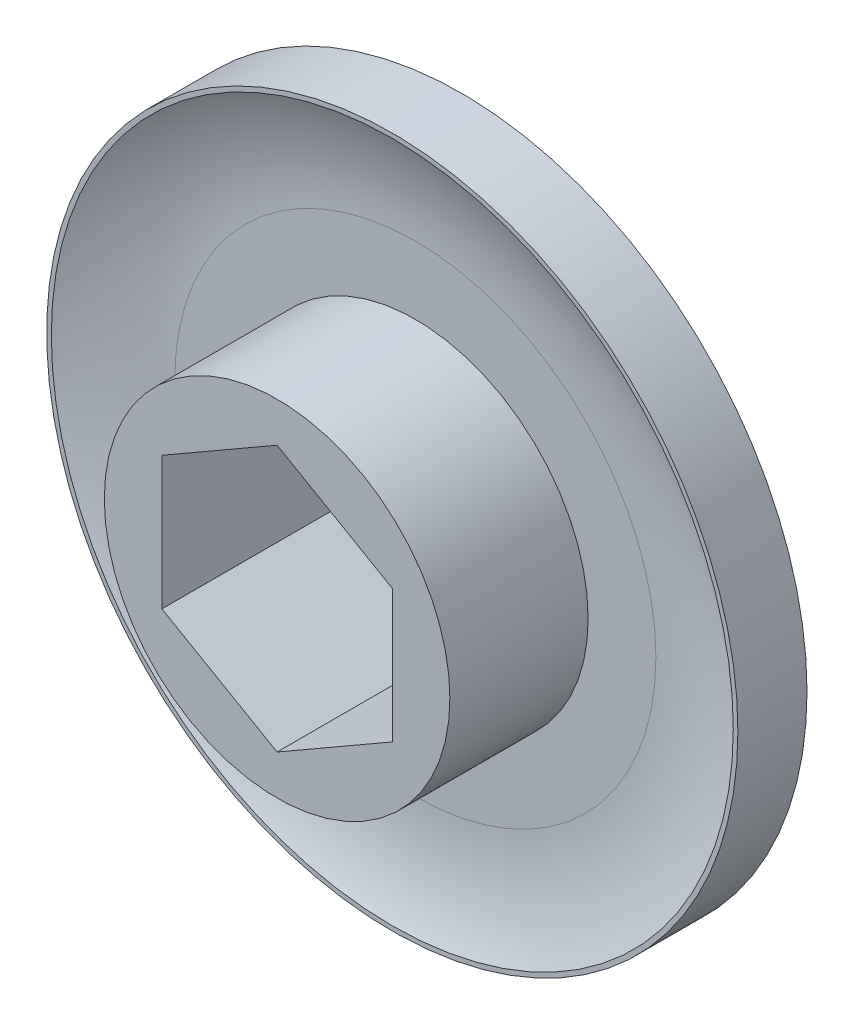
ISO-10303-21;
HEADER;
FILE_DESCRIPTION(('STEP AP214'),'2;1');
FILE_NAME('part.step','',(''),(''),'','','');
FILE_SCHEMA(('AUTOMOTIVE_DESIGN { 1 0 10303 214 1 1 1 1 }'));
ENDSEC;
DATA;
#1=APPLICATION_CONTEXT('core data for automotive mechanical design processes');
#2=APPLICATION_PROTOCOL_DEFINITION('international standard','automotive_design',2000,#1);
#3=PRODUCT_CONTEXT('',#1,'mechanical');
#4=PRODUCT('Part','Part','',(#3));
#5=PRODUCT_RELATED_PRODUCT_CATEGORY('part','',(#4));
#6=PRODUCT_DEFINITION_FORMATION('','',#4);
#7=PRODUCT_DEFINITION_CONTEXT('part definition',#1,'design');
#8=PRODUCT_DEFINITION('design','',#6,#7);
#9=PRODUCT_DEFINITION_SHAPE('','',#8);
#10=(LENGTH_UNIT() NAMED_UNIT(*) SI_UNIT(.MILLI.,.METRE.));
#11=(NAMED_UNIT(*) PLANE_ANGLE_UNIT() SI_UNIT($,.RADIAN.));
#12=(NAMED_UNIT(*) SI_UNIT($,.STERADIAN.) SOLID_ANGLE_UNIT());
#13=UNCERTAINTY_MEASURE_WITH_UNIT(LENGTH_MEASURE(1.E-05),#10,'distance_accuracy_value','');
#14=(GEOMETRIC_REPRESENTATION_CONTEXT(3) GLOBAL_UNCERTAINTY_ASSIGNED_CONTEXT((#13)) GLOBAL_UNIT_ASSIGNED_CONTEXT((#10,
#11,#12)) REPRESENTATION_CONTEXT('',''));
#15=CARTESIAN_POINT('',(0.,0.,0.));
#16=DIRECTION('',(0.,0.,1.));
#17=DIRECTION('',(1.,0.,0.));
#18=AXIS2_PLACEMENT_3D('',#15,#16,#17);
#19=CARTESIAN_POINT('',(-11.822558412063,14.5297529469992,2.));
#20=DIRECTION('',(0.,0.,1.));
#21=DIRECTION('',(1.,0.,0.));
#22=AXIS2_PLACEMENT_3D('',#19,#20,#21);
#23=PLANE('',#22);
#24=CARTESIAN_POINT('',(-11.822558412063,14.5297529469992,2.));
#25=DIRECTION('',(0.,0.,1.));
#26=DIRECTION('',(1.,0.,0.));
#27=AXIS2_PLACEMENT_3D('',#24,#25,#26);
#28=CIRCLE('',#27,10.4411010564593);
#29=CARTESIAN_POINT('',(-1.38145735560369,14.5297529469992,2.));
#30=VERTEX_POINT('',#29);
#31=EDGE_CURVE('E12',#30,#30,#28,.T.);
#32=ORIENTED_EDGE('',*,*,#31,.T.);
#33=EDGE_LOOP('',(#32));
#34=FACE_BOUND('',#33,.T.);
#35=CARTESIAN_POINT('',(-11.822558412063,14.5297529469992,2.));
#36=DIRECTION('',(0.,0.,1.));
#37=DIRECTION('',(1.,0.,0.));
#38=AXIS2_PLACEMENT_3D('',#35,#36,#37);
#39=CIRCLE('',#38,7.5);
#40=CARTESIAN_POINT('',(-4.32255841206301,14.5297529469992,2.));
#41=VERTEX_POINT('',#40);
#42=EDGE_CURVE('E105',#41,#41,#39,.F.);
#43=ORIENTED_EDGE('',*,*,#42,.T.);
#44=EDGE_LOOP('',(#43));
#45=FACE_BOUND('',#44,.T.);
#46=ADVANCED_FACE('F37',(#34,#45),#23,.T.);
#47=CARTESIAN_POINT('',(-11.822558412063,14.5297529469992,8.));
#48=DIRECTION('',(0.,0.,1.));
#49=DIRECTION('',(1.,0.,0.));
#50=AXIS2_PLACEMENT_3D('',#47,#48,#49);
#51=PLANE('',#50);
#52=DIRECTION('',(-0.866551126516464,-0.499088313961614,0.));
#53=VECTOR('',#52,1.);
#54=CARTESIAN_POINT('',(-6.73507191009362,11.6938906153389,8.));
#55=LINE('',#54,#53);
#56=CARTESIAN_POINT('',(-6.82255841206301,11.6435029469992,8.));
#57=VERTEX_POINT('',#56);
#58=CARTESIAN_POINT('',(-11.822558412063,8.76376337544067,8.));
#59=VERTEX_POINT('',#58);
#60=EDGE_CURVE('E111',#57,#59,#55,.T.);
#61=ORIENTED_EDGE('',*,*,#60,.T.);
#62=DIRECTION('',(-0.866551126516464,0.499088313961614,0.));
#63=VECTOR('',#62,1.);
#64=CARTESIAN_POINT('',(0.845329973801053,1.46771948086882,8.));
#65=LINE('',#64,#63);
#66=CARTESIAN_POINT('',(-16.822558412063,11.6435029469992,8.));
#67=VERTEX_POINT('',#66);
#68=EDGE_CURVE('E93',#59,#67,#65,.T.);
#69=ORIENTED_EDGE('',*,*,#68,.T.);
#70=DIRECTION('',(0.,1.,0.));
#71=VECTOR('',#70,1.);
#72=CARTESIAN_POINT('',(-16.822558412063,0.,8.));
#73=LINE('',#72,#71);
#74=CARTESIAN_POINT('',(-16.822558412063,17.4160029469992,8.));
#75=VERTEX_POINT('',#74);
#76=EDGE_CURVE('E101',#67,#75,#73,.T.);
#77=ORIENTED_EDGE('',*,*,#76,.T.);
#78=DIRECTION('',(0.866551126516465,0.499088313961614,0.));
#79=VECTOR('',#78,1.);
#80=CARTESIAN_POINT('',(-11.7224861450839,20.3533789320048,8.));
#81=LINE('',#80,#79);
#82=CARTESIAN_POINT('',(-11.822558412063,20.2957425185577,8.));
#83=VERTEX_POINT('',#82);
#84=EDGE_CURVE('E52',#75,#83,#81,.T.);
#85=ORIENTED_EDGE('',*,*,#84,.T.);
#86=DIRECTION('',(0.866551126516465,-0.499088313961613,0.));
#87=VECTOR('',#86,1.);
#88=CARTESIAN_POINT('',(5.83274420879133,10.1272077975347,8.));
#89=LINE('',#88,#87);
#90=CARTESIAN_POINT('',(-6.82255841206301,17.4160029469992,8.));
#91=VERTEX_POINT('',#90);
#92=EDGE_CURVE('E119',#83,#91,#89,.T.);
#93=ORIENTED_EDGE('',*,*,#92,.T.);
#94=DIRECTION('',(0.,1.,0.));
#95=VECTOR('',#94,1.);
#96=CARTESIAN_POINT('',(-6.82255841206301,0.,8.));
#97=LINE('',#96,#95);
#98=EDGE_CURVE('E113',#57,#91,#97,.T.);
#99=ORIENTED_EDGE('',*,*,#98,.F.);
#100=EDGE_LOOP('',(#61,#69,#77,#85,#93,#99));
#101=FACE_BOUND('',#100,.T.);
#102=CARTESIAN_POINT('',(-11.822558412063,14.5297529469992,8.));
#103=DIRECTION('',(0.,0.,1.));
#104=DIRECTION('',(1.,0.,0.));
#105=AXIS2_PLACEMENT_3D('',#102,#103,#104);
#106=CIRCLE('',#105,7.5);
#107=CARTESIAN_POINT('',(-4.32255841206301,14.5297529469992,8.));
#108=VERTEX_POINT('',#107);
#109=EDGE_CURVE('E150',#108,#108,#106,.T.);
#110=ORIENTED_EDGE('',*,*,#109,.T.);
#111=EDGE_LOOP('',(#110));
#112=FACE_BOUND('',#111,.T.);
#113=ADVANCED_FACE('F107',(#101,#112),#51,.T.);
#114=CARTESIAN_POINT('',(-11.822558412063,14.5297529469992,8.));
#115=DIRECTION('',(0.,0.,-1.));
#116=DIRECTION('',(-1.,0.,0.));
#117=AXIS2_PLACEMENT_3D('',#114,#115,#116);
#118=CYLINDRICAL_SURFACE('',#117,15.);
#119=CARTESIAN_POINT('',(-11.822558412063,14.5297529469992,0.));
#120=DIRECTION('',(0.,0.,1.));
#121=DIRECTION('',(1.,0.,0.));
#122=AXIS2_PLACEMENT_3D('',#119,#120,#121);
#123=CIRCLE('',#122,15.);
#124=CARTESIAN_POINT('',(3.17744158793699,14.5297529469992,0.));
#125=VERTEX_POINT('',#124);
#126=EDGE_CURVE('E45',#125,#125,#123,.T.);
#127=ORIENTED_EDGE('',*,*,#126,.T.);
#128=EDGE_LOOP('',(#127));
#129=FACE_BOUND('',#128,.T.);
#130=CARTESIAN_POINT('',(-11.822558412063,14.5297529469992,3.));
#131=DIRECTION('',(0.,0.,1.));
#132=DIRECTION('',(1.,0.,0.));
#133=AXIS2_PLACEMENT_3D('',#130,#131,#132);
#134=CIRCLE('',#133,15.);
#135=CARTESIAN_POINT('',(3.17744158793699,14.5297529469992,3.));
#136=VERTEX_POINT('',#135);
#137=EDGE_CURVE('E153',#136,#136,#134,.T.);
#138=ORIENTED_EDGE('',*,*,#137,.F.);
#139=EDGE_LOOP('',(#138));
#140=FACE_BOUND('',#139,.T.);
#141=ADVANCED_FACE('F179',(#129,#140),#118,.T.);
#142=CARTESIAN_POINT('',(-11.822558412063,14.5297529469992,0.));
#143=DIRECTION('',(0.,0.,1.));
#144=DIRECTION('',(1.,0.,0.));
#145=AXIS2_PLACEMENT_3D('',#142,#143,#144);
#146=PLANE('',#145);
#147=ORIENTED_EDGE('',*,*,#126,.F.);
#148=EDGE_LOOP('',(#147));
#149=FACE_BOUND('',#148,.T.);
#150=DIRECTION('',(0.866551126516464,-0.499088313961614,0.));
#151=VECTOR('',#150,1.);
#152=CARTESIAN_POINT('',(0.845329973801053,1.46771948086882,0.));
#153=LINE('',#152,#151);
#154=CARTESIAN_POINT('',(-16.822558412063,11.6435029469992,0.));
#155=VERTEX_POINT('',#154);
#156=CARTESIAN_POINT('',(-11.822558412063,8.76376337544067,0.));
#157=VERTEX_POINT('',#156);
#158=EDGE_CURVE('E96',#155,#157,#153,.T.);
#159=ORIENTED_EDGE('',*,*,#158,.T.);
#160=DIRECTION('',(0.866551126516464,0.499088313961614,0.));
#161=VECTOR('',#160,1.);
#162=CARTESIAN_POINT('',(-6.73507191009362,11.6938906153389,0.));
#163=LINE('',#162,#161);
#164=CARTESIAN_POINT('',(-6.82255841206301,11.6435029469992,0.));
#165=VERTEX_POINT('',#164);
#166=EDGE_CURVE('E131',#157,#165,#163,.T.);
#167=ORIENTED_EDGE('',*,*,#166,.T.);
#168=DIRECTION('',(0.,-1.,0.));
#169=VECTOR('',#168,1.);
#170=CARTESIAN_POINT('',(-6.82255841206301,0.,0.));
#171=LINE('',#170,#169);
#172=CARTESIAN_POINT('',(-6.82255841206301,17.4160029469992,0.));
#173=VERTEX_POINT('',#172);
#174=EDGE_CURVE('E144',#173,#165,#171,.T.);
#175=ORIENTED_EDGE('',*,*,#174,.F.);
#176=DIRECTION('',(-0.866551126516465,0.499088313961613,0.));
#177=VECTOR('',#176,1.);
#178=CARTESIAN_POINT('',(5.83274420879133,10.1272077975347,0.));
#179=LINE('',#178,#177);
#180=CARTESIAN_POINT('',(-11.822558412063,20.2957425185577,0.));
#181=VERTEX_POINT('',#180);
#182=EDGE_CURVE('E139',#173,#181,#179,.T.);
#183=ORIENTED_EDGE('',*,*,#182,.T.);
#184=DIRECTION('',(-0.866551126516465,-0.499088313961614,0.));
#185=VECTOR('',#184,1.);
#186=CARTESIAN_POINT('',(-11.7224861450839,20.3533789320048,0.));
#187=LINE('',#186,#185);
#188=CARTESIAN_POINT('',(-16.822558412063,17.4160029469992,0.));
#189=VERTEX_POINT('',#188);
#190=EDGE_CURVE('E136',#181,#189,#187,.T.);
#191=ORIENTED_EDGE('',*,*,#190,.T.);
#192=DIRECTION('',(0.,-1.,0.));
#193=VECTOR('',#192,1.);
#194=CARTESIAN_POINT('',(-16.822558412063,0.,0.));
#195=LINE('',#194,#193);
#196=EDGE_CURVE('E133',#189,#155,#195,.T.);
#197=ORIENTED_EDGE('',*,*,#196,.T.);
#198=EDGE_LOOP('',(#159,#167,#175,#183,#191,#197));
#199=FACE_BOUND('',#198,.T.);
#200=ADVANCED_FACE('F200',(#149,#199),#146,.F.);
#201=CARTESIAN_POINT('',(0.845329973801053,1.46771948086882,-15.2638967160187));
#202=DIRECTION('',(0.499088313961614,0.866551126516464,0.));
#203=DIRECTION('',(-0.866551126516464,0.499088313961614,0.));
#204=AXIS2_PLACEMENT_3D('',#201,#202,#203);
#205=PLANE('',#204);
#206=DIRECTION('',(0.,0.,1.));
#207=VECTOR('',#206,1.);
#208=CARTESIAN_POINT('',(-16.822558412063,11.6435029469992,-15.2638967160187));
#209=LINE('',#208,#207);
#210=EDGE_CURVE('E60',#155,#67,#209,.T.);
#211=ORIENTED_EDGE('',*,*,#210,.T.);
#212=ORIENTED_EDGE('',*,*,#68,.F.);
#213=DIRECTION('',(0.,0.,1.));
#214=VECTOR('',#213,1.);
#215=CARTESIAN_POINT('',(-11.822558412063,8.76376337544067,-15.2638967160187));
#216=LINE('',#215,#214);
#217=EDGE_CURVE('E98',#157,#59,#216,.T.);
#218=ORIENTED_EDGE('',*,*,#217,.F.);
#219=ORIENTED_EDGE('',*,*,#158,.F.);
#220=EDGE_LOOP('',(#211,#212,#218,#219));
#221=FACE_BOUND('',#220,.T.);
#222=ADVANCED_FACE('F90',(#221),#205,.T.);
#223=CARTESIAN_POINT('',(-6.73507191009362,11.6938906153389,-15.2638967160187));
#224=DIRECTION('',(-0.499088313961614,0.866551126516464,0.));
#225=DIRECTION('',(-0.866551126516464,-0.499088313961614,0.));
#226=AXIS2_PLACEMENT_3D('',#223,#224,#225);
#227=PLANE('',#226);
#228=ORIENTED_EDGE('',*,*,#217,.T.);
#229=ORIENTED_EDGE('',*,*,#60,.F.);
#230=DIRECTION('',(0.,0.,1.));
#231=VECTOR('',#230,1.);
#232=CARTESIAN_POINT('',(-6.82255841206301,11.6435029469992,-15.2638967160187));
#233=LINE('',#232,#231);
#234=EDGE_CURVE('E128',#165,#57,#233,.T.);
#235=ORIENTED_EDGE('',*,*,#234,.F.);
#236=ORIENTED_EDGE('',*,*,#166,.F.);
#237=EDGE_LOOP('',(#228,#229,#235,#236));
#238=FACE_BOUND('',#237,.T.);
#239=ADVANCED_FACE('F193',(#238),#227,.T.);
#240=CARTESIAN_POINT('',(-6.82255841206301,0.,-15.2638967160187));
#241=DIRECTION('',(1.,0.,0.));
#242=DIRECTION('',(0.,0.,-1.));
#243=AXIS2_PLACEMENT_3D('',#240,#241,#242);
#244=PLANE('',#243);
#245=ORIENTED_EDGE('',*,*,#174,.T.);
#246=ORIENTED_EDGE('',*,*,#234,.T.);
#247=ORIENTED_EDGE('',*,*,#98,.T.);
#248=DIRECTION('',(0.,0.,1.));
#249=VECTOR('',#248,1.);
#250=CARTESIAN_POINT('',(-6.82255841206301,17.4160029469992,-15.2638967160187));
#251=LINE('',#250,#249);
#252=EDGE_CURVE('E126',#173,#91,#251,.T.);
#253=ORIENTED_EDGE('',*,*,#252,.F.);
#254=EDGE_LOOP('',(#245,#246,#247,#253));
#255=FACE_BOUND('',#254,.T.);
#256=ADVANCED_FACE('F189',(#255),#244,.F.);
#257=CARTESIAN_POINT('',(5.83274420879133,10.1272077975347,-15.2638967160187));
#258=DIRECTION('',(-0.499088313961613,-0.866551126516465,0.));
#259=DIRECTION('',(0.866551126516465,-0.499088313961613,0.));
#260=AXIS2_PLACEMENT_3D('',#257,#258,#259);
#261=PLANE('',#260);
#262=ORIENTED_EDGE('',*,*,#252,.T.);
#263=ORIENTED_EDGE('',*,*,#92,.F.);
#264=DIRECTION('',(0.,0.,1.));
#265=VECTOR('',#264,1.);
#266=CARTESIAN_POINT('',(-11.822558412063,20.2957425185577,-15.2638967160187));
#267=LINE('',#266,#265);
#268=EDGE_CURVE('E124',#181,#83,#267,.T.);
#269=ORIENTED_EDGE('',*,*,#268,.F.);
#270=ORIENTED_EDGE('',*,*,#182,.F.);
#271=EDGE_LOOP('',(#262,#263,#269,#270));
#272=FACE_BOUND('',#271,.T.);
#273=ADVANCED_FACE('F186',(#272),#261,.T.);
#274=CARTESIAN_POINT('',(-11.7224861450839,20.3533789320048,-15.2638967160187));
#275=DIRECTION('',(0.499088313961613,-0.866551126516465,0.));
#276=DIRECTION('',(0.866551126516465,0.499088313961614,0.));
#277=AXIS2_PLACEMENT_3D('',#274,#275,#276);
#278=PLANE('',#277);
#279=ORIENTED_EDGE('',*,*,#268,.T.);
#280=ORIENTED_EDGE('',*,*,#84,.F.);
#281=DIRECTION('',(0.,0.,1.));
#282=VECTOR('',#281,1.);
#283=CARTESIAN_POINT('',(-16.822558412063,17.4160029469992,-15.2638967160187));
#284=LINE('',#283,#282);
#285=EDGE_CURVE('E103',#189,#75,#284,.T.);
#286=ORIENTED_EDGE('',*,*,#285,.F.);
#287=ORIENTED_EDGE('',*,*,#190,.F.);
#288=EDGE_LOOP('',(#279,#280,#286,#287));
#289=FACE_BOUND('',#288,.T.);
#290=ADVANCED_FACE('F183',(#289),#278,.T.);
#291=CARTESIAN_POINT('',(-16.822558412063,0.,-15.2638967160187));
#292=DIRECTION('',(1.,0.,0.));
#293=DIRECTION('',(0.,0.,-1.));
#294=AXIS2_PLACEMENT_3D('',#291,#292,#293);
#295=PLANE('',#294);
#296=ORIENTED_EDGE('',*,*,#285,.T.);
#297=ORIENTED_EDGE('',*,*,#76,.F.);
#298=ORIENTED_EDGE('',*,*,#210,.F.);
#299=ORIENTED_EDGE('',*,*,#196,.F.);
#300=EDGE_LOOP('',(#296,#297,#298,#299));
#301=FACE_BOUND('',#300,.T.);
#302=ADVANCED_FACE('F102',(#301),#295,.T.);
#303=CARTESIAN_POINT('',(-11.822558412063,14.5297529469992,-42.4264068711929));
#304=DIRECTION('',(0.,0.,1.));
#305=DIRECTION('',(1.,0.,0.));
#306=AXIS2_PLACEMENT_3D('',#303,#304,#305);
#307=CYLINDRICAL_SURFACE('',#306,7.5);
#308=ORIENTED_EDGE('',*,*,#42,.F.);
#309=EDGE_LOOP('',(#308));
#310=FACE_BOUND('',#309,.T.);
#311=ORIENTED_EDGE('',*,*,#109,.F.);
#312=EDGE_LOOP('',(#311));
#313=FACE_BOUND('',#312,.T.);
#314=ADVANCED_FACE('F163',(#310,#313),#307,.T.);
#315=CARTESIAN_POINT('',(-11.822558412063,14.5297529469992,3.));
#316=DIRECTION('',(0.,0.,1.));
#317=DIRECTION('',(1.,0.,0.));
#318=AXIS2_PLACEMENT_3D('',#315,#316,#317);
#319=PLANE('',#318);
#320=ORIENTED_EDGE('',*,*,#137,.T.);
#321=EDGE_LOOP('',(#320));
#322=FACE_BOUND('',#321,.T.);
#323=CARTESIAN_POINT('',(-11.822558412063,14.5297529469992,3.));
#324=DIRECTION('',(0.,0.,1.));
#325=DIRECTION('',(1.,0.,0.));
#326=AXIS2_PLACEMENT_3D('',#323,#324,#325);
#327=CIRCLE('',#326,14.8);
#328=CARTESIAN_POINT('',(2.97744158793699,14.5297529469992,3.));
#329=VERTEX_POINT('',#328);
#330=EDGE_CURVE('E156',#329,#329,#327,.T.);
#331=ORIENTED_EDGE('',*,*,#330,.F.);
#332=EDGE_LOOP('',(#331));
#333=FACE_BOUND('',#332,.T.);
#334=ADVANCED_FACE('F161',(#322,#333),#319,.T.);
#335=CARTESIAN_POINT('',(-11.822558412063,14.5297529469992,12.));
#336=DIRECTION('',(0.,0.,-1.));
#337=DIRECTION('',(-1.,0.,0.));
#338=AXIS2_PLACEMENT_3D('',#335,#336,#337);
#339=TOROIDAL_SURFACE('',#338,10.4411010564593,10.);
#340=ORIENTED_EDGE('',*,*,#31,.F.);
#341=EDGE_LOOP('',(#340));
#342=FACE_BOUND('',#341,.T.);
#343=ORIENTED_EDGE('',*,*,#330,.T.);
#344=EDGE_LOOP('',(#343));
#345=FACE_BOUND('',#344,.T.);
#346=ADVANCED_FACE('F39',(#342,#345),#339,.F.);
#347=CLOSED_SHELL('',(#46,#113,#141,#200,#222,#239,#256,#273,#290,#302,#314,#334,#346));
#348=MANIFOLD_SOLID_BREP('B2',#347);
#349=ADVANCED_BREP_SHAPE_REPRESENTATION('',(#18,#348),#14);
#350=SHAPE_DEFINITION_REPRESENTATION(#9,#349);
ENDSEC;
END-ISO-10303-21;
